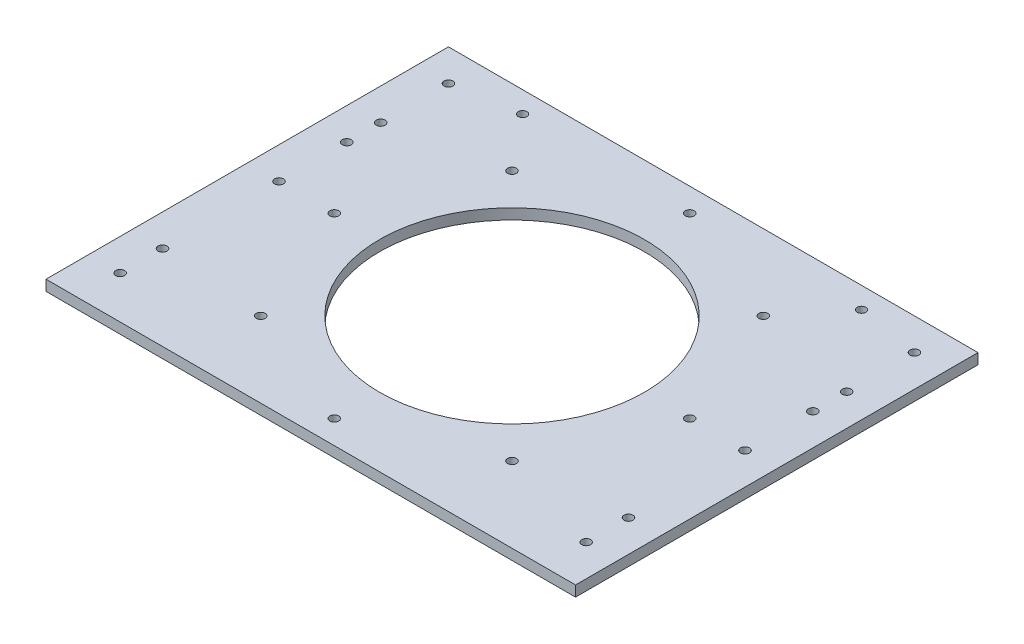
ISO-10303-21;
HEADER;
FILE_DESCRIPTION(('STEP AP214'),'2;1');
FILE_NAME('part.step','',(''),(''),'','','');
FILE_SCHEMA(('AUTOMOTIVE_DESIGN { 1 0 10303 214 1 1 1 1 }'));
ENDSEC;
DATA;
#1=APPLICATION_CONTEXT('core data for automotive mechanical design processes');
#2=APPLICATION_PROTOCOL_DEFINITION('international standard','automotive_design',2000,#1);
#3=PRODUCT_CONTEXT('',#1,'mechanical');
#4=PRODUCT('Part','Part','',(#3));
#5=PRODUCT_RELATED_PRODUCT_CATEGORY('part','',(#4));
#6=PRODUCT_DEFINITION_FORMATION('','',#4);
#7=PRODUCT_DEFINITION_CONTEXT('part definition',#1,'design');
#8=PRODUCT_DEFINITION('design','',#6,#7);
#9=PRODUCT_DEFINITION_SHAPE('','',#8);
#10=(LENGTH_UNIT() NAMED_UNIT(*) SI_UNIT(.MILLI.,.METRE.));
#11=(NAMED_UNIT(*) PLANE_ANGLE_UNIT() SI_UNIT($,.RADIAN.));
#12=(NAMED_UNIT(*) SI_UNIT($,.STERADIAN.) SOLID_ANGLE_UNIT());
#13=UNCERTAINTY_MEASURE_WITH_UNIT(LENGTH_MEASURE(1.E-05),#10,'distance_accuracy_value','');
#14=(GEOMETRIC_REPRESENTATION_CONTEXT(3) GLOBAL_UNCERTAINTY_ASSIGNED_CONTEXT((#13)) GLOBAL_UNIT_ASSIGNED_CONTEXT((#10,
#11,#12)) REPRESENTATION_CONTEXT('',''));
#15=CARTESIAN_POINT('',(0.,0.,0.));
#16=DIRECTION('',(0.,0.,1.));
#17=DIRECTION('',(1.,0.,0.));
#18=AXIS2_PLACEMENT_3D('',#15,#16,#17);
#19=CARTESIAN_POINT('',(125.,5.,-95.));
#20=DIRECTION('',(-1.,0.,0.));
#21=DIRECTION('',(0.,0.,1.));
#22=AXIS2_PLACEMENT_3D('',#19,#20,#21);
#23=PLANE('',#22);
#24=DIRECTION('',(0.,0.,-1.));
#25=VECTOR('',#24,1.);
#26=CARTESIAN_POINT('',(125.,0.,-95.));
#27=LINE('',#26,#25);
#28=CARTESIAN_POINT('',(125.,0.,95.));
#29=VERTEX_POINT('',#28);
#30=CARTESIAN_POINT('',(125.,0.,-95.));
#31=VERTEX_POINT('',#30);
#32=EDGE_CURVE('E108',#29,#31,#27,.T.);
#33=ORIENTED_EDGE('',*,*,#32,.T.);
#34=DIRECTION('',(0.,-1.,0.));
#35=VECTOR('',#34,1.);
#36=CARTESIAN_POINT('',(125.,5.,-95.));
#37=LINE('',#36,#35);
#38=CARTESIAN_POINT('',(125.,5.,-95.));
#39=VERTEX_POINT('',#38);
#40=EDGE_CURVE('E12',#39,#31,#37,.T.);
#41=ORIENTED_EDGE('',*,*,#40,.F.);
#42=DIRECTION('',(0.,0.,-1.));
#43=VECTOR('',#42,1.);
#44=CARTESIAN_POINT('',(125.,5.,-95.));
#45=LINE('',#44,#43);
#46=CARTESIAN_POINT('',(125.,5.,95.));
#47=VERTEX_POINT('',#46);
#48=EDGE_CURVE('E95',#47,#39,#45,.T.);
#49=ORIENTED_EDGE('',*,*,#48,.F.);
#50=DIRECTION('',(0.,-1.,0.));
#51=VECTOR('',#50,1.);
#52=CARTESIAN_POINT('',(125.,5.,95.));
#53=LINE('',#52,#51);
#54=EDGE_CURVE('E104',#47,#29,#53,.T.);
#55=ORIENTED_EDGE('',*,*,#54,.T.);
#56=EDGE_LOOP('',(#33,#41,#49,#55));
#57=FACE_BOUND('',#56,.T.);
#58=ADVANCED_FACE('F42',(#57),#23,.F.);
#59=CARTESIAN_POINT('',(-125.,5.,-95.));
#60=DIRECTION('',(0.,0.,1.));
#61=DIRECTION('',(1.,0.,0.));
#62=AXIS2_PLACEMENT_3D('',#59,#60,#61);
#63=PLANE('',#62);
#64=DIRECTION('',(-1.,0.,0.));
#65=VECTOR('',#64,1.);
#66=CARTESIAN_POINT('',(-125.,0.,-95.));
#67=LINE('',#66,#65);
#68=CARTESIAN_POINT('',(-125.,0.,-95.));
#69=VERTEX_POINT('',#68);
#70=EDGE_CURVE('E99',#31,#69,#67,.T.);
#71=ORIENTED_EDGE('',*,*,#70,.T.);
#72=DIRECTION('',(0.,-1.,0.));
#73=VECTOR('',#72,1.);
#74=CARTESIAN_POINT('',(-125.,5.,-95.));
#75=LINE('',#74,#73);
#76=CARTESIAN_POINT('',(-125.,5.,-95.));
#77=VERTEX_POINT('',#76);
#78=EDGE_CURVE('E51',#77,#69,#75,.T.);
#79=ORIENTED_EDGE('',*,*,#78,.F.);
#80=DIRECTION('',(-1.,0.,0.));
#81=VECTOR('',#80,1.);
#82=CARTESIAN_POINT('',(-125.,5.,-95.));
#83=LINE('',#82,#81);
#84=EDGE_CURVE('E90',#39,#77,#83,.T.);
#85=ORIENTED_EDGE('',*,*,#84,.F.);
#86=ORIENTED_EDGE('',*,*,#40,.T.);
#87=EDGE_LOOP('',(#71,#79,#85,#86));
#88=FACE_BOUND('',#87,.T.);
#89=ADVANCED_FACE('F98',(#88),#63,.F.);
#90=CARTESIAN_POINT('',(-125.,5.,-95.));
#91=DIRECTION('',(1.,0.,0.));
#92=DIRECTION('',(0.,0.,-1.));
#93=AXIS2_PLACEMENT_3D('',#90,#91,#92);
#94=PLANE('',#93);
#95=DIRECTION('',(0.,0.,1.));
#96=VECTOR('',#95,1.);
#97=CARTESIAN_POINT('',(-125.,0.,-95.));
#98=LINE('',#97,#96);
#99=CARTESIAN_POINT('',(-125.,0.,95.));
#100=VERTEX_POINT('',#99);
#101=EDGE_CURVE('E77',#69,#100,#98,.T.);
#102=ORIENTED_EDGE('',*,*,#101,.T.);
#103=DIRECTION('',(0.,-1.,0.));
#104=VECTOR('',#103,1.);
#105=CARTESIAN_POINT('',(-125.,5.,95.));
#106=LINE('',#105,#104);
#107=CARTESIAN_POINT('',(-125.,5.,95.));
#108=VERTEX_POINT('',#107);
#109=EDGE_CURVE('E100',#108,#100,#106,.T.);
#110=ORIENTED_EDGE('',*,*,#109,.F.);
#111=DIRECTION('',(0.,0.,1.));
#112=VECTOR('',#111,1.);
#113=CARTESIAN_POINT('',(-125.,5.,-95.));
#114=LINE('',#113,#112);
#115=EDGE_CURVE('E93',#77,#108,#114,.T.);
#116=ORIENTED_EDGE('',*,*,#115,.F.);
#117=ORIENTED_EDGE('',*,*,#78,.T.);
#118=EDGE_LOOP('',(#102,#110,#116,#117));
#119=FACE_BOUND('',#118,.T.);
#120=ADVANCED_FACE('F102',(#119),#94,.F.);
#121=CARTESIAN_POINT('',(-125.,5.,95.));
#122=DIRECTION('',(0.,0.,-1.));
#123=DIRECTION('',(-1.,0.,0.));
#124=AXIS2_PLACEMENT_3D('',#121,#122,#123);
#125=PLANE('',#124);
#126=DIRECTION('',(1.,0.,0.));
#127=VECTOR('',#126,1.);
#128=CARTESIAN_POINT('',(-125.,0.,95.));
#129=LINE('',#128,#127);
#130=EDGE_CURVE('E83',#100,#29,#129,.T.);
#131=ORIENTED_EDGE('',*,*,#130,.T.);
#132=ORIENTED_EDGE('',*,*,#54,.F.);
#133=DIRECTION('',(1.,0.,0.));
#134=VECTOR('',#133,1.);
#135=CARTESIAN_POINT('',(-125.,5.,95.));
#136=LINE('',#135,#134);
#137=EDGE_CURVE('E60',#108,#47,#136,.T.);
#138=ORIENTED_EDGE('',*,*,#137,.F.);
#139=ORIENTED_EDGE('',*,*,#109,.T.);
#140=EDGE_LOOP('',(#131,#132,#138,#139));
#141=FACE_BOUND('',#140,.T.);
#142=ADVANCED_FACE('F261',(#141),#125,.F.);
#143=CARTESIAN_POINT('',(0.,5.,0.));
#144=DIRECTION('',(0.,1.,0.));
#145=DIRECTION('',(0.,0.,1.));
#146=AXIS2_PLACEMENT_3D('',#143,#144,#145);
#147=PLANE('',#146);
#148=CARTESIAN_POINT('',(80.0000000000002,5.,-85.));
#149=DIRECTION('',(0.,1.,0.));
#150=DIRECTION('',(0.,0.,1.));
#151=AXIS2_PLACEMENT_3D('',#148,#149,#150);
#152=CIRCLE('',#151,2.04999999999881);
#153=CARTESIAN_POINT('',(80.0000000000002,5.,-82.9500000000012));
#154=VERTEX_POINT('',#153);
#155=EDGE_CURVE('E153',#154,#154,#152,.T.);
#156=ORIENTED_EDGE('',*,*,#155,.F.);
#157=EDGE_LOOP('',(#156));
#158=FACE_BOUND('',#157,.T.);
#159=CARTESIAN_POINT('',(-79.9999999999998,5.,-85.));
#160=DIRECTION('',(0.,1.,0.));
#161=DIRECTION('',(0.,0.,1.));
#162=AXIS2_PLACEMENT_3D('',#159,#160,#161);
#163=CIRCLE('',#162,2.04999999999879);
#164=CARTESIAN_POINT('',(-79.9999999999998,5.,-82.9500000000012));
#165=VERTEX_POINT('',#164);
#166=EDGE_CURVE('E147',#165,#165,#163,.T.);
#167=ORIENTED_EDGE('',*,*,#166,.F.);
#168=EDGE_LOOP('',(#167));
#169=FACE_BOUND('',#168,.T.);
#170=CARTESIAN_POINT('',(110.,5.,75.));
#171=DIRECTION('',(0.,1.,0.));
#172=DIRECTION('',(0.,0.,-1.));
#173=AXIS2_PLACEMENT_3D('',#170,#171,#172);
#174=CIRCLE('',#173,2.1);
#175=CARTESIAN_POINT('',(110.,5.,72.9));
#176=VERTEX_POINT('',#175);
#177=EDGE_CURVE('E193',#176,#176,#174,.T.);
#178=ORIENTED_EDGE('',*,*,#177,.F.);
#179=EDGE_LOOP('',(#178));
#180=FACE_BOUND('',#179,.T.);
#181=CARTESIAN_POINT('',(-110.,5.,-32.));
#182=DIRECTION('',(0.,1.,0.));
#183=DIRECTION('',(0.,0.,1.));
#184=AXIS2_PLACEMENT_3D('',#181,#182,#183);
#185=CIRCLE('',#184,2.1);
#186=CARTESIAN_POINT('',(-110.,5.,-29.9));
#187=VERTEX_POINT('',#186);
#188=EDGE_CURVE('E194',#187,#187,#185,.T.);
#189=ORIENTED_EDGE('',*,*,#188,.F.);
#190=EDGE_LOOP('',(#189));
#191=FACE_BOUND('',#190,.T.);
#192=CARTESIAN_POINT('',(-110.,5.,0.));
#193=DIRECTION('',(0.,1.,0.));
#194=DIRECTION('',(0.,0.,1.));
#195=AXIS2_PLACEMENT_3D('',#192,#193,#194);
#196=CIRCLE('',#195,2.1);
#197=CARTESIAN_POINT('',(-110.,5.,2.09999999999998));
#198=VERTEX_POINT('',#197);
#199=EDGE_CURVE('E181',#198,#198,#196,.T.);
#200=ORIENTED_EDGE('',*,*,#199,.F.);
#201=EDGE_LOOP('',(#200));
#202=FACE_BOUND('',#201,.T.);
#203=CARTESIAN_POINT('',(110.,5.,-32.));
#204=DIRECTION('',(0.,1.,0.));
#205=DIRECTION('',(0.,0.,-1.));
#206=AXIS2_PLACEMENT_3D('',#203,#204,#205);
#207=CIRCLE('',#206,2.1);
#208=CARTESIAN_POINT('',(110.,5.,-34.1));
#209=VERTEX_POINT('',#208);
#210=EDGE_CURVE('E182',#209,#209,#207,.T.);
#211=ORIENTED_EDGE('',*,*,#210,.F.);
#212=EDGE_LOOP('',(#211));
#213=FACE_BOUND('',#212,.T.);
#214=CARTESIAN_POINT('',(-110.,5.,-48.));
#215=DIRECTION('',(0.,1.,0.));
#216=DIRECTION('',(0.,0.,1.));
#217=AXIS2_PLACEMENT_3D('',#214,#215,#216);
#218=CIRCLE('',#217,2.1);
#219=CARTESIAN_POINT('',(-110.,5.,-45.9));
#220=VERTEX_POINT('',#219);
#221=EDGE_CURVE('E217',#220,#220,#218,.T.);
#222=ORIENTED_EDGE('',*,*,#221,.F.);
#223=EDGE_LOOP('',(#222));
#224=FACE_BOUND('',#223,.T.);
#225=CARTESIAN_POINT('',(110.,5.,-48.));
#226=DIRECTION('',(0.,1.,0.));
#227=DIRECTION('',(0.,0.,-1.));
#228=AXIS2_PLACEMENT_3D('',#225,#226,#227);
#229=CIRCLE('',#228,2.1);
#230=CARTESIAN_POINT('',(110.,5.,-50.1));
#231=VERTEX_POINT('',#230);
#232=EDGE_CURVE('E218',#231,#231,#229,.T.);
#233=ORIENTED_EDGE('',*,*,#232,.F.);
#234=EDGE_LOOP('',(#233));
#235=FACE_BOUND('',#234,.T.);
#236=CARTESIAN_POINT('',(110.,5.,-80.));
#237=DIRECTION('',(0.,1.,0.));
#238=DIRECTION('',(0.,0.,-1.));
#239=AXIS2_PLACEMENT_3D('',#236,#237,#238);
#240=CIRCLE('',#239,2.1);
#241=CARTESIAN_POINT('',(110.,5.,-82.1));
#242=VERTEX_POINT('',#241);
#243=EDGE_CURVE('E205',#242,#242,#240,.T.);
#244=ORIENTED_EDGE('',*,*,#243,.F.);
#245=EDGE_LOOP('',(#244));
#246=FACE_BOUND('',#245,.T.);
#247=CARTESIAN_POINT('',(-110.,5.,75.));
#248=DIRECTION('',(0.,1.,0.));
#249=DIRECTION('',(0.,0.,1.));
#250=AXIS2_PLACEMENT_3D('',#247,#248,#249);
#251=CIRCLE('',#250,2.1);
#252=CARTESIAN_POINT('',(-110.,5.,77.1));
#253=VERTEX_POINT('',#252);
#254=EDGE_CURVE('E206',#253,#253,#251,.T.);
#255=ORIENTED_EDGE('',*,*,#254,.F.);
#256=EDGE_LOOP('',(#255));
#257=FACE_BOUND('',#256,.T.);
#258=CARTESIAN_POINT('',(110.,5.,55.));
#259=DIRECTION('',(0.,1.,0.));
#260=DIRECTION('',(0.,0.,-1.));
#261=AXIS2_PLACEMENT_3D('',#258,#259,#260);
#262=CIRCLE('',#261,2.1);
#263=CARTESIAN_POINT('',(110.,5.,52.9));
#264=VERTEX_POINT('',#263);
#265=EDGE_CURVE('E162',#264,#264,#262,.T.);
#266=ORIENTED_EDGE('',*,*,#265,.F.);
#267=EDGE_LOOP('',(#266));
#268=FACE_BOUND('',#267,.T.);
#269=CARTESIAN_POINT('',(-110.,5.,55.));
#270=DIRECTION('',(0.,1.,0.));
#271=DIRECTION('',(0.,0.,1.));
#272=AXIS2_PLACEMENT_3D('',#269,#270,#271);
#273=CIRCLE('',#272,2.1);
#274=CARTESIAN_POINT('',(-110.,5.,57.1));
#275=VERTEX_POINT('',#274);
#276=EDGE_CURVE('E170',#275,#275,#273,.T.);
#277=ORIENTED_EDGE('',*,*,#276,.F.);
#278=EDGE_LOOP('',(#277));
#279=FACE_BOUND('',#278,.T.);
#280=CARTESIAN_POINT('',(110.,5.,0.));
#281=DIRECTION('',(0.,1.,0.));
#282=DIRECTION('',(0.,0.,-1.));
#283=AXIS2_PLACEMENT_3D('',#280,#281,#282);
#284=CIRCLE('',#283,2.1);
#285=CARTESIAN_POINT('',(110.,5.,-2.10000000000003));
#286=VERTEX_POINT('',#285);
#287=EDGE_CURVE('E169',#286,#286,#284,.T.);
#288=ORIENTED_EDGE('',*,*,#287,.F.);
#289=EDGE_LOOP('',(#288));
#290=FACE_BOUND('',#289,.T.);
#291=CARTESIAN_POINT('',(-110.,5.,-80.));
#292=DIRECTION('',(0.,1.,0.));
#293=DIRECTION('',(0.,0.,1.));
#294=AXIS2_PLACEMENT_3D('',#291,#292,#293);
#295=CIRCLE('',#294,2.1);
#296=CARTESIAN_POINT('',(-110.,5.,-77.9));
#297=VERTEX_POINT('',#296);
#298=EDGE_CURVE('E221',#297,#297,#295,.T.);
#299=ORIENTED_EDGE('',*,*,#298,.F.);
#300=EDGE_LOOP('',(#299));
#301=FACE_BOUND('',#300,.T.);
#302=CARTESIAN_POINT('',(0.,5.,0.));
#303=DIRECTION('',(0.,1.,0.));
#304=DIRECTION('',(0.,0.,1.));
#305=AXIS2_PLACEMENT_3D('',#302,#303,#304);
#306=CIRCLE('',#305,62.5);
#307=CARTESIAN_POINT('',(0.,5.,62.5));
#308=VERTEX_POINT('',#307);
#309=EDGE_CURVE('E144',#308,#308,#306,.T.);
#310=ORIENTED_EDGE('',*,*,#309,.F.);
#311=EDGE_LOOP('',(#310));
#312=FACE_BOUND('',#311,.T.);
#313=CARTESIAN_POINT('',(-83.9,5.,0.));
#314=DIRECTION('',(0.,1.,0.));
#315=DIRECTION('',(0.,0.,1.));
#316=AXIS2_PLACEMENT_3D('',#313,#314,#315);
#317=CIRCLE('',#316,2.1);
#318=CARTESIAN_POINT('',(-83.9,5.,2.1));
#319=VERTEX_POINT('',#318);
#320=EDGE_CURVE('E121',#319,#319,#317,.T.);
#321=ORIENTED_EDGE('',*,*,#320,.F.);
#322=EDGE_LOOP('',(#321));
#323=FACE_BOUND('',#322,.T.);
#324=CARTESIAN_POINT('',(-59.3262589415513,5.,-59.3262589415513));
#325=DIRECTION('',(0.,1.,0.));
#326=DIRECTION('',(0.,0.,1.));
#327=AXIS2_PLACEMENT_3D('',#324,#325,#326);
#328=CIRCLE('',#327,2.1);
#329=CARTESIAN_POINT('',(-59.3262589415513,5.,-57.2262589415513));
#330=VERTEX_POINT('',#329);
#331=EDGE_CURVE('E235',#330,#330,#328,.T.);
#332=ORIENTED_EDGE('',*,*,#331,.F.);
#333=EDGE_LOOP('',(#332));
#334=FACE_BOUND('',#333,.T.);
#335=CARTESIAN_POINT('',(0.,5.,-83.9));
#336=DIRECTION('',(0.,1.,0.));
#337=DIRECTION('',(0.,0.,1.));
#338=AXIS2_PLACEMENT_3D('',#335,#336,#337);
#339=CIRCLE('',#338,2.1);
#340=CARTESIAN_POINT('',(0.,5.,-81.8));
#341=VERTEX_POINT('',#340);
#342=EDGE_CURVE('E238',#341,#341,#339,.T.);
#343=ORIENTED_EDGE('',*,*,#342,.F.);
#344=EDGE_LOOP('',(#343));
#345=FACE_BOUND('',#344,.T.);
#346=CARTESIAN_POINT('',(59.3262589415514,5.,-59.3262589415514));
#347=DIRECTION('',(0.,1.,0.));
#348=DIRECTION('',(0.,0.,1.));
#349=AXIS2_PLACEMENT_3D('',#346,#347,#348);
#350=CIRCLE('',#349,2.1);
#351=CARTESIAN_POINT('',(59.3262589415514,5.,-57.2262589415514));
#352=VERTEX_POINT('',#351);
#353=EDGE_CURVE('E241',#352,#352,#350,.T.);
#354=ORIENTED_EDGE('',*,*,#353,.F.);
#355=EDGE_LOOP('',(#354));
#356=FACE_BOUND('',#355,.T.);
#357=CARTESIAN_POINT('',(83.9,5.,0.));
#358=DIRECTION('',(0.,1.,0.));
#359=DIRECTION('',(0.,0.,1.));
#360=AXIS2_PLACEMENT_3D('',#357,#358,#359);
#361=CIRCLE('',#360,2.1);
#362=CARTESIAN_POINT('',(83.9,5.,2.1));
#363=VERTEX_POINT('',#362);
#364=EDGE_CURVE('E244',#363,#363,#361,.T.);
#365=ORIENTED_EDGE('',*,*,#364,.F.);
#366=EDGE_LOOP('',(#365));
#367=FACE_BOUND('',#366,.T.);
#368=CARTESIAN_POINT('',(59.3262589415514,5.,59.3262589415514));
#369=DIRECTION('',(0.,1.,0.));
#370=DIRECTION('',(0.,0.,1.));
#371=AXIS2_PLACEMENT_3D('',#368,#369,#370);
#372=CIRCLE('',#371,2.1);
#373=CARTESIAN_POINT('',(59.3262589415514,5.,61.4262589415514));
#374=VERTEX_POINT('',#373);
#375=EDGE_CURVE('E247',#374,#374,#372,.T.);
#376=ORIENTED_EDGE('',*,*,#375,.F.);
#377=EDGE_LOOP('',(#376));
#378=FACE_BOUND('',#377,.T.);
#379=CARTESIAN_POINT('',(0.,5.,83.9));
#380=DIRECTION('',(0.,1.,0.));
#381=DIRECTION('',(0.,0.,1.));
#382=AXIS2_PLACEMENT_3D('',#379,#380,#381);
#383=CIRCLE('',#382,2.1);
#384=CARTESIAN_POINT('',(0.,5.,86.));
#385=VERTEX_POINT('',#384);
#386=EDGE_CURVE('E250',#385,#385,#383,.T.);
#387=ORIENTED_EDGE('',*,*,#386,.F.);
#388=EDGE_LOOP('',(#387));
#389=FACE_BOUND('',#388,.T.);
#390=CARTESIAN_POINT('',(-59.3262589415514,5.,59.3262589415513));
#391=DIRECTION('',(0.,1.,0.));
#392=DIRECTION('',(0.,0.,1.));
#393=AXIS2_PLACEMENT_3D('',#390,#391,#392);
#394=CIRCLE('',#393,2.1);
#395=CARTESIAN_POINT('',(-59.3262589415514,5.,61.4262589415513));
#396=VERTEX_POINT('',#395);
#397=EDGE_CURVE('E143',#396,#396,#394,.T.);
#398=ORIENTED_EDGE('',*,*,#397,.F.);
#399=EDGE_LOOP('',(#398));
#400=FACE_BOUND('',#399,.T.);
#401=ORIENTED_EDGE('',*,*,#48,.T.);
#402=ORIENTED_EDGE('',*,*,#84,.T.);
#403=ORIENTED_EDGE('',*,*,#115,.T.);
#404=ORIENTED_EDGE('',*,*,#137,.T.);
#405=EDGE_LOOP('',(#401,#402,#403,#404));
#406=FACE_BOUND('',#405,.T.);
#407=ADVANCED_FACE('F91',(#158,#169,#180,#191,#202,#213,#224,#235,#246,#257,#268,#279,#290,#301,
#312,#323,#334,#345,#356,#367,#378,#389,#400,#406),#147,.T.);
#408=CARTESIAN_POINT('',(0.,0.,0.));
#409=DIRECTION('',(0.,1.,0.));
#410=DIRECTION('',(0.,0.,1.));
#411=AXIS2_PLACEMENT_3D('',#408,#409,#410);
#412=PLANE('',#411);
#413=CARTESIAN_POINT('',(80.0000000000002,0.,-85.));
#414=DIRECTION('',(0.,1.,0.));
#415=DIRECTION('',(0.,0.,1.));
#416=AXIS2_PLACEMENT_3D('',#413,#414,#415);
#417=CIRCLE('',#416,2.04999999999881);
#418=CARTESIAN_POINT('',(80.0000000000002,0.,-82.9500000000012));
#419=VERTEX_POINT('',#418);
#420=EDGE_CURVE('E45',#419,#419,#417,.T.);
#421=ORIENTED_EDGE('',*,*,#420,.T.);
#422=EDGE_LOOP('',(#421));
#423=FACE_BOUND('',#422,.T.);
#424=CARTESIAN_POINT('',(-79.9999999999998,0.,-85.));
#425=DIRECTION('',(0.,1.,0.));
#426=DIRECTION('',(0.,0.,1.));
#427=AXIS2_PLACEMENT_3D('',#424,#425,#426);
#428=CIRCLE('',#427,2.04999999999879);
#429=CARTESIAN_POINT('',(-79.9999999999998,0.,-82.9500000000012));
#430=VERTEX_POINT('',#429);
#431=EDGE_CURVE('E145',#430,#430,#428,.T.);
#432=ORIENTED_EDGE('',*,*,#431,.T.);
#433=EDGE_LOOP('',(#432));
#434=FACE_BOUND('',#433,.T.);
#435=CARTESIAN_POINT('',(110.,0.,75.));
#436=DIRECTION('',(0.,1.,0.));
#437=DIRECTION('',(0.,0.,1.));
#438=AXIS2_PLACEMENT_3D('',#435,#436,#437);
#439=CIRCLE('',#438,2.1);
#440=CARTESIAN_POINT('',(110.,0.,77.1));
#441=VERTEX_POINT('',#440);
#442=EDGE_CURVE('E190',#441,#441,#439,.F.);
#443=ORIENTED_EDGE('',*,*,#442,.F.);
#444=EDGE_LOOP('',(#443));
#445=FACE_BOUND('',#444,.T.);
#446=CARTESIAN_POINT('',(-110.,0.,-32.));
#447=DIRECTION('',(0.,1.,0.));
#448=DIRECTION('',(0.,0.,1.));
#449=AXIS2_PLACEMENT_3D('',#446,#447,#448);
#450=CIRCLE('',#449,2.1);
#451=CARTESIAN_POINT('',(-110.,0.,-29.9));
#452=VERTEX_POINT('',#451);
#453=EDGE_CURVE('E185',#452,#452,#450,.F.);
#454=ORIENTED_EDGE('',*,*,#453,.F.);
#455=EDGE_LOOP('',(#454));
#456=FACE_BOUND('',#455,.T.);
#457=CARTESIAN_POINT('',(-110.,0.,0.));
#458=DIRECTION('',(0.,1.,0.));
#459=DIRECTION('',(0.,0.,1.));
#460=AXIS2_PLACEMENT_3D('',#457,#458,#459);
#461=CIRCLE('',#460,2.1);
#462=CARTESIAN_POINT('',(-110.,0.,2.09999999999998));
#463=VERTEX_POINT('',#462);
#464=EDGE_CURVE('E178',#463,#463,#461,.F.);
#465=ORIENTED_EDGE('',*,*,#464,.F.);
#466=EDGE_LOOP('',(#465));
#467=FACE_BOUND('',#466,.T.);
#468=CARTESIAN_POINT('',(110.,0.,-32.));
#469=DIRECTION('',(0.,1.,0.));
#470=DIRECTION('',(0.,0.,1.));
#471=AXIS2_PLACEMENT_3D('',#468,#469,#470);
#472=CIRCLE('',#471,2.1);
#473=CARTESIAN_POINT('',(110.,0.,-29.9));
#474=VERTEX_POINT('',#473);
#475=EDGE_CURVE('E173',#474,#474,#472,.F.);
#476=ORIENTED_EDGE('',*,*,#475,.F.);
#477=EDGE_LOOP('',(#476));
#478=FACE_BOUND('',#477,.T.);
#479=CARTESIAN_POINT('',(-110.,0.,-48.));
#480=DIRECTION('',(0.,1.,0.));
#481=DIRECTION('',(0.,0.,1.));
#482=AXIS2_PLACEMENT_3D('',#479,#480,#481);
#483=CIRCLE('',#482,2.1);
#484=CARTESIAN_POINT('',(-110.,0.,-45.9));
#485=VERTEX_POINT('',#484);
#486=EDGE_CURVE('E214',#485,#485,#483,.F.);
#487=ORIENTED_EDGE('',*,*,#486,.F.);
#488=EDGE_LOOP('',(#487));
#489=FACE_BOUND('',#488,.T.);
#490=CARTESIAN_POINT('',(110.,0.,-48.));
#491=DIRECTION('',(0.,1.,0.));
#492=DIRECTION('',(0.,0.,1.));
#493=AXIS2_PLACEMENT_3D('',#490,#491,#492);
#494=CIRCLE('',#493,2.1);
#495=CARTESIAN_POINT('',(110.,0.,-45.9));
#496=VERTEX_POINT('',#495);
#497=EDGE_CURVE('E209',#496,#496,#494,.F.);
#498=ORIENTED_EDGE('',*,*,#497,.F.);
#499=EDGE_LOOP('',(#498));
#500=FACE_BOUND('',#499,.T.);
#501=CARTESIAN_POINT('',(110.,0.,-80.));
#502=DIRECTION('',(0.,1.,0.));
#503=DIRECTION('',(0.,0.,1.));
#504=AXIS2_PLACEMENT_3D('',#501,#502,#503);
#505=CIRCLE('',#504,2.1);
#506=CARTESIAN_POINT('',(110.,0.,-77.9));
#507=VERTEX_POINT('',#506);
#508=EDGE_CURVE('E202',#507,#507,#505,.F.);
#509=ORIENTED_EDGE('',*,*,#508,.F.);
#510=EDGE_LOOP('',(#509));
#511=FACE_BOUND('',#510,.T.);
#512=CARTESIAN_POINT('',(-110.,0.,75.));
#513=DIRECTION('',(0.,1.,0.));
#514=DIRECTION('',(0.,0.,1.));
#515=AXIS2_PLACEMENT_3D('',#512,#513,#514);
#516=CIRCLE('',#515,2.1);
#517=CARTESIAN_POINT('',(-110.,0.,77.1));
#518=VERTEX_POINT('',#517);
#519=EDGE_CURVE('E197',#518,#518,#516,.F.);
#520=ORIENTED_EDGE('',*,*,#519,.F.);
#521=EDGE_LOOP('',(#520));
#522=FACE_BOUND('',#521,.T.);
#523=CARTESIAN_POINT('',(110.,0.,55.));
#524=DIRECTION('',(0.,1.,0.));
#525=DIRECTION('',(0.,0.,1.));
#526=AXIS2_PLACEMENT_3D('',#523,#524,#525);
#527=CIRCLE('',#526,2.1);
#528=CARTESIAN_POINT('',(110.,0.,57.1));
#529=VERTEX_POINT('',#528);
#530=EDGE_CURVE('E151',#529,#529,#527,.F.);
#531=ORIENTED_EDGE('',*,*,#530,.F.);
#532=EDGE_LOOP('',(#531));
#533=FACE_BOUND('',#532,.T.);
#534=CARTESIAN_POINT('',(-110.,0.,55.));
#535=DIRECTION('',(0.,1.,0.));
#536=DIRECTION('',(0.,0.,1.));
#537=AXIS2_PLACEMENT_3D('',#534,#535,#536);
#538=CIRCLE('',#537,2.1);
#539=CARTESIAN_POINT('',(-110.,0.,57.1));
#540=VERTEX_POINT('',#539);
#541=EDGE_CURVE('E165',#540,#540,#538,.F.);
#542=ORIENTED_EDGE('',*,*,#541,.F.);
#543=EDGE_LOOP('',(#542));
#544=FACE_BOUND('',#543,.T.);
#545=CARTESIAN_POINT('',(110.,0.,0.));
#546=DIRECTION('',(0.,1.,0.));
#547=DIRECTION('',(0.,0.,1.));
#548=AXIS2_PLACEMENT_3D('',#545,#546,#547);
#549=CIRCLE('',#548,2.1);
#550=CARTESIAN_POINT('',(110.,0.,2.09999999999998));
#551=VERTEX_POINT('',#550);
#552=EDGE_CURVE('E166',#551,#551,#549,.F.);
#553=ORIENTED_EDGE('',*,*,#552,.F.);
#554=EDGE_LOOP('',(#553));
#555=FACE_BOUND('',#554,.T.);
#556=CARTESIAN_POINT('',(-110.,0.,-80.));
#557=DIRECTION('',(0.,1.,0.));
#558=DIRECTION('',(0.,0.,1.));
#559=AXIS2_PLACEMENT_3D('',#556,#557,#558);
#560=CIRCLE('',#559,2.1);
#561=CARTESIAN_POINT('',(-110.,0.,-77.9));
#562=VERTEX_POINT('',#561);
#563=EDGE_CURVE('E228',#562,#562,#560,.F.);
#564=ORIENTED_EDGE('',*,*,#563,.F.);
#565=EDGE_LOOP('',(#564));
#566=FACE_BOUND('',#565,.T.);
#567=CARTESIAN_POINT('',(0.,0.,0.));
#568=DIRECTION('',(0.,1.,0.));
#569=DIRECTION('',(0.,0.,1.));
#570=AXIS2_PLACEMENT_3D('',#567,#568,#569);
#571=CIRCLE('',#570,62.5);
#572=CARTESIAN_POINT('',(0.,0.,62.5));
#573=VERTEX_POINT('',#572);
#574=EDGE_CURVE('E141',#573,#573,#571,.T.);
#575=ORIENTED_EDGE('',*,*,#574,.T.);
#576=EDGE_LOOP('',(#575));
#577=FACE_BOUND('',#576,.T.);
#578=CARTESIAN_POINT('',(-83.9,0.,0.));
#579=DIRECTION('',(0.,1.,0.));
#580=DIRECTION('',(0.,0.,1.));
#581=AXIS2_PLACEMENT_3D('',#578,#579,#580);
#582=CIRCLE('',#581,2.1);
#583=CARTESIAN_POINT('',(-83.9,0.,2.1));
#584=VERTEX_POINT('',#583);
#585=EDGE_CURVE('E111',#584,#584,#582,.T.);
#586=ORIENTED_EDGE('',*,*,#585,.T.);
#587=EDGE_LOOP('',(#586));
#588=FACE_BOUND('',#587,.T.);
#589=CARTESIAN_POINT('',(-59.3262589415513,0.,-59.3262589415513));
#590=DIRECTION('',(0.,1.,0.));
#591=DIRECTION('',(0.,0.,1.));
#592=AXIS2_PLACEMENT_3D('',#589,#590,#591);
#593=CIRCLE('',#592,2.1);
#594=CARTESIAN_POINT('',(-59.3262589415513,0.,-57.2262589415513));
#595=VERTEX_POINT('',#594);
#596=EDGE_CURVE('E136',#595,#595,#593,.T.);
#597=ORIENTED_EDGE('',*,*,#596,.T.);
#598=EDGE_LOOP('',(#597));
#599=FACE_BOUND('',#598,.T.);
#600=CARTESIAN_POINT('',(0.,0.,-83.9));
#601=DIRECTION('',(0.,1.,0.));
#602=DIRECTION('',(0.,0.,1.));
#603=AXIS2_PLACEMENT_3D('',#600,#601,#602);
#604=CIRCLE('',#603,2.1);
#605=CARTESIAN_POINT('',(0.,0.,-81.8));
#606=VERTEX_POINT('',#605);
#607=EDGE_CURVE('E133',#606,#606,#604,.T.);
#608=ORIENTED_EDGE('',*,*,#607,.T.);
#609=EDGE_LOOP('',(#608));
#610=FACE_BOUND('',#609,.T.);
#611=CARTESIAN_POINT('',(59.3262589415514,0.,-59.3262589415514));
#612=DIRECTION('',(0.,1.,0.));
#613=DIRECTION('',(0.,0.,1.));
#614=AXIS2_PLACEMENT_3D('',#611,#612,#613);
#615=CIRCLE('',#614,2.1);
#616=CARTESIAN_POINT('',(59.3262589415514,0.,-57.2262589415514));
#617=VERTEX_POINT('',#616);
#618=EDGE_CURVE('E130',#617,#617,#615,.T.);
#619=ORIENTED_EDGE('',*,*,#618,.T.);
#620=EDGE_LOOP('',(#619));
#621=FACE_BOUND('',#620,.T.);
#622=CARTESIAN_POINT('',(83.9,0.,0.));
#623=DIRECTION('',(0.,1.,0.));
#624=DIRECTION('',(0.,0.,1.));
#625=AXIS2_PLACEMENT_3D('',#622,#623,#624);
#626=CIRCLE('',#625,2.1);
#627=CARTESIAN_POINT('',(83.9,0.,2.1));
#628=VERTEX_POINT('',#627);
#629=EDGE_CURVE('E127',#628,#628,#626,.T.);
#630=ORIENTED_EDGE('',*,*,#629,.T.);
#631=EDGE_LOOP('',(#630));
#632=FACE_BOUND('',#631,.T.);
#633=CARTESIAN_POINT('',(59.3262589415514,0.,59.3262589415514));
#634=DIRECTION('',(0.,1.,0.));
#635=DIRECTION('',(0.,0.,1.));
#636=AXIS2_PLACEMENT_3D('',#633,#634,#635);
#637=CIRCLE('',#636,2.1);
#638=CARTESIAN_POINT('',(59.3262589415514,0.,61.4262589415514));
#639=VERTEX_POINT('',#638);
#640=EDGE_CURVE('E124',#639,#639,#637,.T.);
#641=ORIENTED_EDGE('',*,*,#640,.T.);
#642=EDGE_LOOP('',(#641));
#643=FACE_BOUND('',#642,.T.);
#644=CARTESIAN_POINT('',(0.,0.,83.9));
#645=DIRECTION('',(0.,1.,0.));
#646=DIRECTION('',(0.,0.,1.));
#647=AXIS2_PLACEMENT_3D('',#644,#645,#646);
#648=CIRCLE('',#647,2.1);
#649=CARTESIAN_POINT('',(0.,0.,86.));
#650=VERTEX_POINT('',#649);
#651=EDGE_CURVE('E120',#650,#650,#648,.T.);
#652=ORIENTED_EDGE('',*,*,#651,.T.);
#653=EDGE_LOOP('',(#652));
#654=FACE_BOUND('',#653,.T.);
#655=CARTESIAN_POINT('',(-59.3262589415514,0.,59.3262589415513));
#656=DIRECTION('',(0.,1.,0.));
#657=DIRECTION('',(0.,0.,1.));
#658=AXIS2_PLACEMENT_3D('',#655,#656,#657);
#659=CIRCLE('',#658,2.1);
#660=CARTESIAN_POINT('',(-59.3262589415514,0.,61.4262589415513));
#661=VERTEX_POINT('',#660);
#662=EDGE_CURVE('E117',#661,#661,#659,.T.);
#663=ORIENTED_EDGE('',*,*,#662,.T.);
#664=EDGE_LOOP('',(#663));
#665=FACE_BOUND('',#664,.T.);
#666=ORIENTED_EDGE('',*,*,#32,.F.);
#667=ORIENTED_EDGE('',*,*,#130,.F.);
#668=ORIENTED_EDGE('',*,*,#101,.F.);
#669=ORIENTED_EDGE('',*,*,#70,.F.);
#670=EDGE_LOOP('',(#666,#667,#668,#669));
#671=FACE_BOUND('',#670,.T.);
#672=ADVANCED_FACE('F260',(#423,#434,#445,#456,#467,#478,#489,#500,#511,#522,#533,#544,#555,
#566,#577,#588,#599,#610,#621,#632,#643,#654,#665,#671),#412,.F.);
#673=CARTESIAN_POINT('',(-59.3262589415514,-5.,59.3262589415513));
#674=DIRECTION('',(0.,1.,0.));
#675=DIRECTION('',(0.,0.,1.));
#676=AXIS2_PLACEMENT_3D('',#673,#674,#675);
#677=CYLINDRICAL_SURFACE('',#676,2.1);
#678=ORIENTED_EDGE('',*,*,#397,.T.);
#679=EDGE_LOOP('',(#678));
#680=FACE_BOUND('',#679,.T.);
#681=ORIENTED_EDGE('',*,*,#662,.F.);
#682=EDGE_LOOP('',(#681));
#683=FACE_BOUND('',#682,.T.);
#684=ADVANCED_FACE('F256',(#680,#683),#677,.F.);
#685=CARTESIAN_POINT('',(0.,-5.,83.9));
#686=DIRECTION('',(0.,1.,0.));
#687=DIRECTION('',(0.,0.,1.));
#688=AXIS2_PLACEMENT_3D('',#685,#686,#687);
#689=CYLINDRICAL_SURFACE('',#688,2.1);
#690=ORIENTED_EDGE('',*,*,#386,.T.);
#691=EDGE_LOOP('',(#690));
#692=FACE_BOUND('',#691,.T.);
#693=ORIENTED_EDGE('',*,*,#651,.F.);
#694=EDGE_LOOP('',(#693));
#695=FACE_BOUND('',#694,.T.);
#696=ADVANCED_FACE('F300',(#692,#695),#689,.F.);
#697=CARTESIAN_POINT('',(59.3262589415514,-5.,59.3262589415514));
#698=DIRECTION('',(0.,1.,0.));
#699=DIRECTION('',(0.,0.,1.));
#700=AXIS2_PLACEMENT_3D('',#697,#698,#699);
#701=CYLINDRICAL_SURFACE('',#700,2.1);
#702=ORIENTED_EDGE('',*,*,#375,.T.);
#703=EDGE_LOOP('',(#702));
#704=FACE_BOUND('',#703,.T.);
#705=ORIENTED_EDGE('',*,*,#640,.F.);
#706=EDGE_LOOP('',(#705));
#707=FACE_BOUND('',#706,.T.);
#708=ADVANCED_FACE('F308',(#704,#707),#701,.F.);
#709=CARTESIAN_POINT('',(83.9,-5.,0.));
#710=DIRECTION('',(0.,1.,0.));
#711=DIRECTION('',(0.,0.,1.));
#712=AXIS2_PLACEMENT_3D('',#709,#710,#711);
#713=CYLINDRICAL_SURFACE('',#712,2.1);
#714=ORIENTED_EDGE('',*,*,#364,.T.);
#715=EDGE_LOOP('',(#714));
#716=FACE_BOUND('',#715,.T.);
#717=ORIENTED_EDGE('',*,*,#629,.F.);
#718=EDGE_LOOP('',(#717));
#719=FACE_BOUND('',#718,.T.);
#720=ADVANCED_FACE('F317',(#716,#719),#713,.F.);
#721=CARTESIAN_POINT('',(59.3262589415514,-5.,-59.3262589415514));
#722=DIRECTION('',(0.,1.,0.));
#723=DIRECTION('',(0.,0.,1.));
#724=AXIS2_PLACEMENT_3D('',#721,#722,#723);
#725=CYLINDRICAL_SURFACE('',#724,2.1);
#726=ORIENTED_EDGE('',*,*,#353,.T.);
#727=EDGE_LOOP('',(#726));
#728=FACE_BOUND('',#727,.T.);
#729=ORIENTED_EDGE('',*,*,#618,.F.);
#730=EDGE_LOOP('',(#729));
#731=FACE_BOUND('',#730,.T.);
#732=ADVANCED_FACE('F326',(#728,#731),#725,.F.);
#733=CARTESIAN_POINT('',(0.,-5.,-83.9));
#734=DIRECTION('',(0.,1.,0.));
#735=DIRECTION('',(0.,0.,1.));
#736=AXIS2_PLACEMENT_3D('',#733,#734,#735);
#737=CYLINDRICAL_SURFACE('',#736,2.1);
#738=ORIENTED_EDGE('',*,*,#342,.T.);
#739=EDGE_LOOP('',(#738));
#740=FACE_BOUND('',#739,.T.);
#741=ORIENTED_EDGE('',*,*,#607,.F.);
#742=EDGE_LOOP('',(#741));
#743=FACE_BOUND('',#742,.T.);
#744=ADVANCED_FACE('F335',(#740,#743),#737,.F.);
#745=CARTESIAN_POINT('',(-59.3262589415513,-5.,-59.3262589415513));
#746=DIRECTION('',(0.,1.,0.));
#747=DIRECTION('',(0.,0.,1.));
#748=AXIS2_PLACEMENT_3D('',#745,#746,#747);
#749=CYLINDRICAL_SURFACE('',#748,2.1);
#750=ORIENTED_EDGE('',*,*,#331,.T.);
#751=EDGE_LOOP('',(#750));
#752=FACE_BOUND('',#751,.T.);
#753=ORIENTED_EDGE('',*,*,#596,.F.);
#754=EDGE_LOOP('',(#753));
#755=FACE_BOUND('',#754,.T.);
#756=ADVANCED_FACE('F344',(#752,#755),#749,.F.);
#757=CARTESIAN_POINT('',(-83.9,-5.,0.));
#758=DIRECTION('',(0.,1.,0.));
#759=DIRECTION('',(0.,0.,1.));
#760=AXIS2_PLACEMENT_3D('',#757,#758,#759);
#761=CYLINDRICAL_SURFACE('',#760,2.1);
#762=ORIENTED_EDGE('',*,*,#320,.T.);
#763=EDGE_LOOP('',(#762));
#764=FACE_BOUND('',#763,.T.);
#765=ORIENTED_EDGE('',*,*,#585,.F.);
#766=EDGE_LOOP('',(#765));
#767=FACE_BOUND('',#766,.T.);
#768=ADVANCED_FACE('F353',(#764,#767),#761,.F.);
#769=CARTESIAN_POINT('',(0.,-5.,0.));
#770=DIRECTION('',(0.,1.,0.));
#771=DIRECTION('',(0.,0.,1.));
#772=AXIS2_PLACEMENT_3D('',#769,#770,#771);
#773=CYLINDRICAL_SURFACE('',#772,62.5);
#774=ORIENTED_EDGE('',*,*,#309,.T.);
#775=EDGE_LOOP('',(#774));
#776=FACE_BOUND('',#775,.T.);
#777=ORIENTED_EDGE('',*,*,#574,.F.);
#778=EDGE_LOOP('',(#777));
#779=FACE_BOUND('',#778,.T.);
#780=ADVANCED_FACE('F362',(#776,#779),#773,.F.);
#781=CARTESIAN_POINT('',(-110.,-0.00100000000000013,-80.));
#782=DIRECTION('',(0.,1.,0.));
#783=DIRECTION('',(0.,0.,1.));
#784=AXIS2_PLACEMENT_3D('',#781,#782,#783);
#785=CYLINDRICAL_SURFACE('',#784,2.1);
#786=ORIENTED_EDGE('',*,*,#298,.T.);
#787=EDGE_LOOP('',(#786));
#788=FACE_BOUND('',#787,.T.);
#789=ORIENTED_EDGE('',*,*,#563,.T.);
#790=EDGE_LOOP('',(#789));
#791=FACE_BOUND('',#790,.T.);
#792=ADVANCED_FACE('F371',(#788,#791),#785,.F.);
#793=CARTESIAN_POINT('',(110.,-0.00100000000000013,0.));
#794=DIRECTION('',(0.,1.,0.));
#795=DIRECTION('',(0.,0.,1.));
#796=AXIS2_PLACEMENT_3D('',#793,#794,#795);
#797=CYLINDRICAL_SURFACE('',#796,2.1);
#798=ORIENTED_EDGE('',*,*,#287,.T.);
#799=EDGE_LOOP('',(#798));
#800=FACE_BOUND('',#799,.T.);
#801=ORIENTED_EDGE('',*,*,#552,.T.);
#802=EDGE_LOOP('',(#801));
#803=FACE_BOUND('',#802,.T.);
#804=ADVANCED_FACE('F380',(#800,#803),#797,.F.);
#805=CARTESIAN_POINT('',(-110.,-0.00100000000000013,55.));
#806=DIRECTION('',(0.,1.,0.));
#807=DIRECTION('',(0.,0.,1.));
#808=AXIS2_PLACEMENT_3D('',#805,#806,#807);
#809=CYLINDRICAL_SURFACE('',#808,2.1);
#810=ORIENTED_EDGE('',*,*,#276,.T.);
#811=EDGE_LOOP('',(#810));
#812=FACE_BOUND('',#811,.T.);
#813=ORIENTED_EDGE('',*,*,#541,.T.);
#814=EDGE_LOOP('',(#813));
#815=FACE_BOUND('',#814,.T.);
#816=ADVANCED_FACE('F389',(#812,#815),#809,.F.);
#817=CARTESIAN_POINT('',(110.,-0.00100000000000013,55.));
#818=DIRECTION('',(0.,1.,0.));
#819=DIRECTION('',(0.,0.,1.));
#820=AXIS2_PLACEMENT_3D('',#817,#818,#819);
#821=CYLINDRICAL_SURFACE('',#820,2.1);
#822=ORIENTED_EDGE('',*,*,#265,.T.);
#823=EDGE_LOOP('',(#822));
#824=FACE_BOUND('',#823,.T.);
#825=ORIENTED_EDGE('',*,*,#530,.T.);
#826=EDGE_LOOP('',(#825));
#827=FACE_BOUND('',#826,.T.);
#828=ADVANCED_FACE('F398',(#824,#827),#821,.F.);
#829=CARTESIAN_POINT('',(-110.,-0.00100000000000013,75.));
#830=DIRECTION('',(0.,1.,0.));
#831=DIRECTION('',(0.,0.,1.));
#832=AXIS2_PLACEMENT_3D('',#829,#830,#831);
#833=CYLINDRICAL_SURFACE('',#832,2.1);
#834=ORIENTED_EDGE('',*,*,#254,.T.);
#835=EDGE_LOOP('',(#834));
#836=FACE_BOUND('',#835,.T.);
#837=ORIENTED_EDGE('',*,*,#519,.T.);
#838=EDGE_LOOP('',(#837));
#839=FACE_BOUND('',#838,.T.);
#840=ADVANCED_FACE('F407',(#836,#839),#833,.F.);
#841=CARTESIAN_POINT('',(110.,-0.00100000000000013,-80.));
#842=DIRECTION('',(0.,1.,0.));
#843=DIRECTION('',(0.,0.,1.));
#844=AXIS2_PLACEMENT_3D('',#841,#842,#843);
#845=CYLINDRICAL_SURFACE('',#844,2.1);
#846=ORIENTED_EDGE('',*,*,#243,.T.);
#847=EDGE_LOOP('',(#846));
#848=FACE_BOUND('',#847,.T.);
#849=ORIENTED_EDGE('',*,*,#508,.T.);
#850=EDGE_LOOP('',(#849));
#851=FACE_BOUND('',#850,.T.);
#852=ADVANCED_FACE('F416',(#848,#851),#845,.F.);
#853=CARTESIAN_POINT('',(110.,-0.00100000000000013,-48.));
#854=DIRECTION('',(0.,1.,0.));
#855=DIRECTION('',(0.,0.,1.));
#856=AXIS2_PLACEMENT_3D('',#853,#854,#855);
#857=CYLINDRICAL_SURFACE('',#856,2.1);
#858=ORIENTED_EDGE('',*,*,#232,.T.);
#859=EDGE_LOOP('',(#858));
#860=FACE_BOUND('',#859,.T.);
#861=ORIENTED_EDGE('',*,*,#497,.T.);
#862=EDGE_LOOP('',(#861));
#863=FACE_BOUND('',#862,.T.);
#864=ADVANCED_FACE('F425',(#860,#863),#857,.F.);
#865=CARTESIAN_POINT('',(-110.,-0.00100000000000013,-48.));
#866=DIRECTION('',(0.,1.,0.));
#867=DIRECTION('',(0.,0.,1.));
#868=AXIS2_PLACEMENT_3D('',#865,#866,#867);
#869=CYLINDRICAL_SURFACE('',#868,2.1);
#870=ORIENTED_EDGE('',*,*,#221,.T.);
#871=EDGE_LOOP('',(#870));
#872=FACE_BOUND('',#871,.T.);
#873=ORIENTED_EDGE('',*,*,#486,.T.);
#874=EDGE_LOOP('',(#873));
#875=FACE_BOUND('',#874,.T.);
#876=ADVANCED_FACE('F434',(#872,#875),#869,.F.);
#877=CARTESIAN_POINT('',(110.,-0.00100000000000013,-32.));
#878=DIRECTION('',(0.,1.,0.));
#879=DIRECTION('',(0.,0.,1.));
#880=AXIS2_PLACEMENT_3D('',#877,#878,#879);
#881=CYLINDRICAL_SURFACE('',#880,2.1);
#882=ORIENTED_EDGE('',*,*,#210,.T.);
#883=EDGE_LOOP('',(#882));
#884=FACE_BOUND('',#883,.T.);
#885=ORIENTED_EDGE('',*,*,#475,.T.);
#886=EDGE_LOOP('',(#885));
#887=FACE_BOUND('',#886,.T.);
#888=ADVANCED_FACE('F443',(#884,#887),#881,.F.);
#889=CARTESIAN_POINT('',(-110.,-0.00100000000000013,0.));
#890=DIRECTION('',(0.,1.,0.));
#891=DIRECTION('',(0.,0.,1.));
#892=AXIS2_PLACEMENT_3D('',#889,#890,#891);
#893=CYLINDRICAL_SURFACE('',#892,2.1);
#894=ORIENTED_EDGE('',*,*,#199,.T.);
#895=EDGE_LOOP('',(#894));
#896=FACE_BOUND('',#895,.T.);
#897=ORIENTED_EDGE('',*,*,#464,.T.);
#898=EDGE_LOOP('',(#897));
#899=FACE_BOUND('',#898,.T.);
#900=ADVANCED_FACE('F452',(#896,#899),#893,.F.);
#901=CARTESIAN_POINT('',(-110.,-0.00100000000000013,-32.));
#902=DIRECTION('',(0.,1.,0.));
#903=DIRECTION('',(0.,0.,1.));
#904=AXIS2_PLACEMENT_3D('',#901,#902,#903);
#905=CYLINDRICAL_SURFACE('',#904,2.1);
#906=ORIENTED_EDGE('',*,*,#188,.T.);
#907=EDGE_LOOP('',(#906));
#908=FACE_BOUND('',#907,.T.);
#909=ORIENTED_EDGE('',*,*,#453,.T.);
#910=EDGE_LOOP('',(#909));
#911=FACE_BOUND('',#910,.T.);
#912=ADVANCED_FACE('F461',(#908,#911),#905,.F.);
#913=CARTESIAN_POINT('',(110.,-0.00100000000000013,75.));
#914=DIRECTION('',(0.,1.,0.));
#915=DIRECTION('',(0.,0.,1.));
#916=AXIS2_PLACEMENT_3D('',#913,#914,#915);
#917=CYLINDRICAL_SURFACE('',#916,2.1);
#918=ORIENTED_EDGE('',*,*,#177,.T.);
#919=EDGE_LOOP('',(#918));
#920=FACE_BOUND('',#919,.T.);
#921=ORIENTED_EDGE('',*,*,#442,.T.);
#922=EDGE_LOOP('',(#921));
#923=FACE_BOUND('',#922,.T.);
#924=ADVANCED_FACE('F469',(#920,#923),#917,.F.);
#925=CARTESIAN_POINT('',(-79.9999999999998,-5.,-85.));
#926=DIRECTION('',(0.,1.,0.));
#927=DIRECTION('',(0.,0.,1.));
#928=AXIS2_PLACEMENT_3D('',#925,#926,#927);
#929=CYLINDRICAL_SURFACE('',#928,2.04999999999879);
#930=ORIENTED_EDGE('',*,*,#166,.T.);
#931=EDGE_LOOP('',(#930));
#932=FACE_BOUND('',#931,.T.);
#933=ORIENTED_EDGE('',*,*,#431,.F.);
#934=EDGE_LOOP('',(#933));
#935=FACE_BOUND('',#934,.T.);
#936=ADVANCED_FACE('F477',(#932,#935),#929,.F.);
#937=CARTESIAN_POINT('',(80.0000000000002,-5.,-85.));
#938=DIRECTION('',(0.,1.,0.));
#939=DIRECTION('',(0.,0.,1.));
#940=AXIS2_PLACEMENT_3D('',#937,#938,#939);
#941=CYLINDRICAL_SURFACE('',#940,2.04999999999881);
#942=ORIENTED_EDGE('',*,*,#155,.T.);
#943=EDGE_LOOP('',(#942));
#944=FACE_BOUND('',#943,.T.);
#945=ORIENTED_EDGE('',*,*,#420,.F.);
#946=EDGE_LOOP('',(#945));
#947=FACE_BOUND('',#946,.T.);
#948=ADVANCED_FACE('F490',(#944,#947),#941,.F.);
#949=CLOSED_SHELL('',(#58,#89,#120,#142,#407,#672,#684,#696,#708,#720,#732,#744,#756,#768,#780,
#792,#804,#816,#828,#840,#852,#864,#876,#888,#900,#912,#924,#936,#948));
#950=MANIFOLD_SOLID_BREP('B2',#949);
#951=ADVANCED_BREP_SHAPE_REPRESENTATION('',(#18,#950),#14);
#952=SHAPE_DEFINITION_REPRESENTATION(#9,#951);
ENDSEC;
END-ISO-10303-21;
